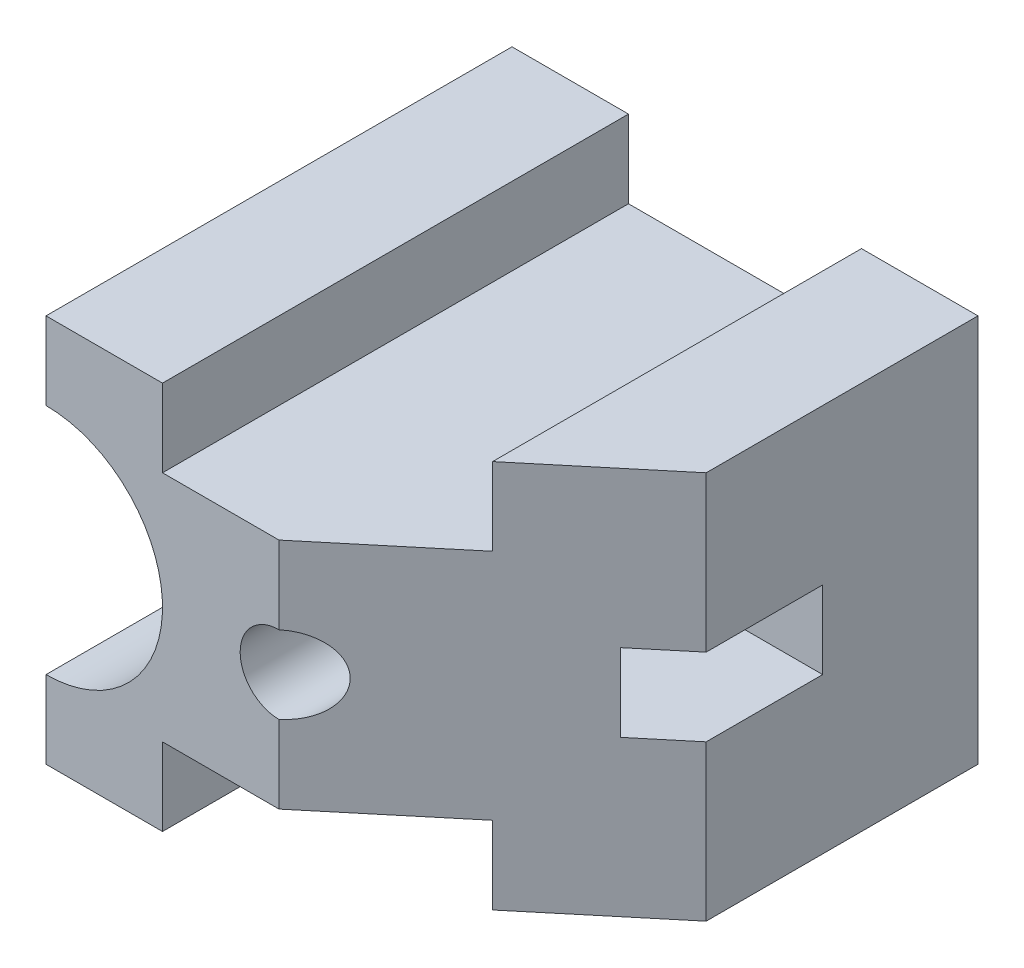
ISO-10303-21;
HEADER;
FILE_DESCRIPTION(('STEP AP214'),'2;1');
FILE_NAME('part.step','',(''),(''),'','','');
FILE_SCHEMA(('AUTOMOTIVE_DESIGN { 1 0 10303 214 1 1 1 1 }'));
ENDSEC;
DATA;
#1=APPLICATION_CONTEXT('core data for automotive mechanical design processes');
#2=APPLICATION_PROTOCOL_DEFINITION('international standard','automotive_design',2000,#1);
#3=PRODUCT_CONTEXT('',#1,'mechanical');
#4=PRODUCT('Part','Part','',(#3));
#5=PRODUCT_RELATED_PRODUCT_CATEGORY('part','',(#4));
#6=PRODUCT_DEFINITION_FORMATION('','',#4);
#7=PRODUCT_DEFINITION_CONTEXT('part definition',#1,'design');
#8=PRODUCT_DEFINITION('design','',#6,#7);
#9=PRODUCT_DEFINITION_SHAPE('','',#8);
#10=(LENGTH_UNIT() NAMED_UNIT(*) SI_UNIT(.MILLI.,.METRE.));
#11=(NAMED_UNIT(*) PLANE_ANGLE_UNIT() SI_UNIT($,.RADIAN.));
#12=(NAMED_UNIT(*) SI_UNIT($,.STERADIAN.) SOLID_ANGLE_UNIT());
#13=UNCERTAINTY_MEASURE_WITH_UNIT(LENGTH_MEASURE(1.E-05),#10,'distance_accuracy_value','');
#14=(GEOMETRIC_REPRESENTATION_CONTEXT(3) GLOBAL_UNCERTAINTY_ASSIGNED_CONTEXT((#13)) GLOBAL_UNIT_ASSIGNED_CONTEXT((#10,
#11,#12)) REPRESENTATION_CONTEXT('',''));
#15=CARTESIAN_POINT('',(0.,0.,0.));
#16=DIRECTION('',(0.,0.,1.));
#17=DIRECTION('',(1.,0.,0.));
#18=AXIS2_PLACEMENT_3D('',#15,#16,#17);
#19=CARTESIAN_POINT('',(-8.20312500000006,-7.890625,60.));
#20=DIRECTION('',(0.,0.,-1.));
#21=DIRECTION('',(-1.,0.,0.));
#22=AXIS2_PLACEMENT_3D('',#19,#20,#21);
#23=CYLINDRICAL_SURFACE('',#22,5.);
#24=CARTESIAN_POINT('',(-8.20312500000006,-7.890625,40.));
#25=DIRECTION('',(0.,0.,1.));
#26=DIRECTION('',(0.,-1.,0.));
#27=AXIS2_PLACEMENT_3D('',#24,#25,#26);
#28=CIRCLE('',#27,5.);
#29=CARTESIAN_POINT('',(-8.20312500000006,-12.890625,40.));
#30=VERTEX_POINT('',#29);
#31=CARTESIAN_POINT('',(-8.20312500000006,-2.890625,40.));
#32=VERTEX_POINT('',#31);
#33=EDGE_CURVE('E247',#30,#32,#28,.T.);
#34=ORIENTED_EDGE('',*,*,#33,.F.);
#35=EDGE_CURVE('E244',#32,#30,#28,.T.);
#36=ORIENTED_EDGE('',*,*,#35,.F.);
#37=EDGE_LOOP('',(#34,#36));
#38=FACE_BOUND('',#37,.T.);
#39=CARTESIAN_POINT('',(-8.20312500000006,-7.890625,60.));
#40=DIRECTION('',(-0.640184399664481,0.,-0.768221279597375));
#41=DIRECTION('',(0.768221279597375,0.,-0.640184399664481));
#42=AXIS2_PLACEMENT_3D('',#39,#40,#41);
#43=ELLIPSE('',#42,6.50854139658889,5.);
#44=CARTESIAN_POINT('',(-8.20312500000002,-2.890625,60.));
#45=VERTEX_POINT('',#44);
#46=CARTESIAN_POINT('',(-8.20312500000002,-12.890625,60.));
#47=VERTEX_POINT('',#46);
#48=EDGE_CURVE('E424',#45,#47,#43,.T.);
#49=ORIENTED_EDGE('',*,*,#48,.F.);
#50=CARTESIAN_POINT('',(-8.20312500000006,-7.890625,60.));
#51=DIRECTION('',(0.,0.,1.));
#52=DIRECTION('',(1.,0.,0.));
#53=AXIS2_PLACEMENT_3D('',#50,#51,#52);
#54=CIRCLE('',#53,5.);
#55=EDGE_CURVE('E289',#45,#47,#54,.T.);
#56=ORIENTED_EDGE('',*,*,#55,.T.);
#57=EDGE_LOOP('',(#49,#56));
#58=FACE_BOUND('',#57,.T.);
#59=ADVANCED_FACE('F39',(#38,#58),#23,.F.);
#60=CARTESIAN_POINT('',(-38.203125,-7.890625,60.));
#61=DIRECTION('',(0.,0.,1.));
#62=DIRECTION('',(1.,0.,0.));
#63=AXIS2_PLACEMENT_3D('',#60,#61,#62);
#64=PLANE('',#63);
#65=DIRECTION('',(0.,1.,0.));
#66=VECTOR('',#65,1.);
#67=CARTESIAN_POINT('',(-8.20312500000002,-42.890625,60.));
#68=LINE('',#67,#66);
#69=CARTESIAN_POINT('',(-8.20312500000002,7.109375,60.));
#70=VERTEX_POINT('',#69);
#71=EDGE_CURVE('E260',#45,#70,#68,.T.);
#72=ORIENTED_EDGE('',*,*,#71,.T.);
#73=DIRECTION('',(-1.,0.,0.));
#74=VECTOR('',#73,1.);
#75=CARTESIAN_POINT('',(-23.203125,7.109375,60.));
#76=LINE('',#75,#74);
#77=CARTESIAN_POINT('',(-23.203125,7.109375,60.));
#78=VERTEX_POINT('',#77);
#79=EDGE_CURVE('E318',#70,#78,#76,.T.);
#80=ORIENTED_EDGE('',*,*,#79,.T.);
#81=DIRECTION('',(0.,1.,0.));
#82=VECTOR('',#81,1.);
#83=CARTESIAN_POINT('',(-23.203125,17.109375,60.));
#84=LINE('',#83,#82);
#85=CARTESIAN_POINT('',(-23.203125,17.109375,60.));
#86=VERTEX_POINT('',#85);
#87=EDGE_CURVE('E321',#78,#86,#84,.T.);
#88=ORIENTED_EDGE('',*,*,#87,.T.);
#89=DIRECTION('',(-1.,0.,0.));
#90=VECTOR('',#89,1.);
#91=CARTESIAN_POINT('',(-38.203125,17.109375,60.));
#92=LINE('',#91,#90);
#93=CARTESIAN_POINT('',(-38.203125,17.109375,60.));
#94=VERTEX_POINT('',#93);
#95=EDGE_CURVE('E324',#86,#94,#92,.T.);
#96=ORIENTED_EDGE('',*,*,#95,.T.);
#97=DIRECTION('',(0.,-1.,0.));
#98=VECTOR('',#97,1.);
#99=CARTESIAN_POINT('',(-38.203125,17.109375,60.));
#100=LINE('',#99,#98);
#101=CARTESIAN_POINT('',(-38.203125,7.109375,60.));
#102=VERTEX_POINT('',#101);
#103=EDGE_CURVE('E297',#94,#102,#100,.T.);
#104=ORIENTED_EDGE('',*,*,#103,.T.);
#105=CARTESIAN_POINT('',(-38.203125,-7.890625,60.));
#106=DIRECTION('',(0.,0.,-1.));
#107=DIRECTION('',(1.,0.,0.));
#108=AXIS2_PLACEMENT_3D('',#105,#106,#107);
#109=CIRCLE('',#108,15.);
#110=CARTESIAN_POINT('',(-38.203125,-22.890625,60.));
#111=VERTEX_POINT('',#110);
#112=EDGE_CURVE('E301',#102,#111,#109,.T.);
#113=ORIENTED_EDGE('',*,*,#112,.T.);
#114=DIRECTION('',(0.,-1.,0.));
#115=VECTOR('',#114,1.);
#116=CARTESIAN_POINT('',(-38.203125,-22.890625,60.));
#117=LINE('',#116,#115);
#118=CARTESIAN_POINT('',(-38.203125,-32.890625,60.));
#119=VERTEX_POINT('',#118);
#120=EDGE_CURVE('E305',#111,#119,#117,.T.);
#121=ORIENTED_EDGE('',*,*,#120,.T.);
#122=DIRECTION('',(1.,0.,0.));
#123=VECTOR('',#122,1.);
#124=CARTESIAN_POINT('',(-38.203125,-32.890625,60.));
#125=LINE('',#124,#123);
#126=CARTESIAN_POINT('',(-23.203125,-32.890625,60.));
#127=VERTEX_POINT('',#126);
#128=EDGE_CURVE('E308',#119,#127,#125,.T.);
#129=ORIENTED_EDGE('',*,*,#128,.T.);
#130=DIRECTION('',(0.,1.,0.));
#131=VECTOR('',#130,1.);
#132=CARTESIAN_POINT('',(-23.203125,-22.890625,60.));
#133=LINE('',#132,#131);
#134=CARTESIAN_POINT('',(-23.203125,-22.890625,60.));
#135=VERTEX_POINT('',#134);
#136=EDGE_CURVE('E311',#127,#135,#133,.T.);
#137=ORIENTED_EDGE('',*,*,#136,.T.);
#138=DIRECTION('',(1.,0.,0.));
#139=VECTOR('',#138,1.);
#140=CARTESIAN_POINT('',(-23.203125,-22.890625,60.));
#141=LINE('',#140,#139);
#142=CARTESIAN_POINT('',(-8.20312500000002,-22.890625,60.));
#143=VERTEX_POINT('',#142);
#144=EDGE_CURVE('E314',#135,#143,#141,.T.);
#145=ORIENTED_EDGE('',*,*,#144,.T.);
#146=EDGE_CURVE('E264',#143,#47,#68,.T.);
#147=ORIENTED_EDGE('',*,*,#146,.T.);
#148=ORIENTED_EDGE('',*,*,#55,.F.);
#149=EDGE_LOOP('',(#72,#80,#88,#96,#104,#113,#121,#129,#137,#145,#147,#148));
#150=FACE_BOUND('',#149,.T.);
#151=ADVANCED_FACE('F455',(#150),#64,.T.);
#152=CARTESIAN_POINT('',(-38.203125,-7.890625,0.));
#153=DIRECTION('',(0.,0.,1.));
#154=DIRECTION('',(1.,0.,0.));
#155=AXIS2_PLACEMENT_3D('',#152,#153,#154);
#156=PLANE('',#155);
#157=DIRECTION('',(0.,-1.,0.));
#158=VECTOR('',#157,1.);
#159=CARTESIAN_POINT('',(-38.203125,17.109375,0.));
#160=LINE('',#159,#158);
#161=CARTESIAN_POINT('',(-38.203125,17.109375,0.));
#162=VERTEX_POINT('',#161);
#163=CARTESIAN_POINT('',(-38.203125,7.109375,0.));
#164=VERTEX_POINT('',#163);
#165=EDGE_CURVE('E293',#162,#164,#160,.T.);
#166=ORIENTED_EDGE('',*,*,#165,.F.);
#167=DIRECTION('',(-1.,0.,0.));
#168=VECTOR('',#167,1.);
#169=CARTESIAN_POINT('',(-38.203125,17.109375,0.));
#170=LINE('',#169,#168);
#171=CARTESIAN_POINT('',(-23.203125,17.109375,0.));
#172=VERTEX_POINT('',#171);
#173=EDGE_CURVE('E302',#172,#162,#170,.T.);
#174=ORIENTED_EDGE('',*,*,#173,.F.);
#175=DIRECTION('',(0.,1.,0.));
#176=VECTOR('',#175,1.);
#177=CARTESIAN_POINT('',(-23.203125,17.109375,0.));
#178=LINE('',#177,#176);
#179=CARTESIAN_POINT('',(-23.203125,7.109375,0.));
#180=VERTEX_POINT('',#179);
#181=EDGE_CURVE('E370',#180,#172,#178,.T.);
#182=ORIENTED_EDGE('',*,*,#181,.F.);
#183=DIRECTION('',(-1.,0.,0.));
#184=VECTOR('',#183,1.);
#185=CARTESIAN_POINT('',(-23.203125,7.109375,0.));
#186=LINE('',#185,#184);
#187=CARTESIAN_POINT('',(6.79687499999999,7.109375,0.));
#188=VERTEX_POINT('',#187);
#189=EDGE_CURVE('E367',#188,#180,#186,.T.);
#190=ORIENTED_EDGE('',*,*,#189,.F.);
#191=DIRECTION('',(0.,-1.,0.));
#192=VECTOR('',#191,1.);
#193=CARTESIAN_POINT('',(6.7968749999999,17.109375,0.));
#194=LINE('',#193,#192);
#195=CARTESIAN_POINT('',(6.7968749999999,17.109375,0.));
#196=VERTEX_POINT('',#195);
#197=EDGE_CURVE('E363',#196,#188,#194,.T.);
#198=ORIENTED_EDGE('',*,*,#197,.F.);
#199=DIRECTION('',(-1.,0.,0.));
#200=VECTOR('',#199,1.);
#201=CARTESIAN_POINT('',(6.7968749999999,17.109375,0.));
#202=LINE('',#201,#200);
#203=CARTESIAN_POINT('',(21.7968749999999,17.109375,0.));
#204=VERTEX_POINT('',#203);
#205=EDGE_CURVE('E359',#204,#196,#202,.T.);
#206=ORIENTED_EDGE('',*,*,#205,.F.);
#207=DIRECTION('',(0.,1.,0.));
#208=VECTOR('',#207,1.);
#209=CARTESIAN_POINT('',(21.7968749999999,17.109375,0.));
#210=LINE('',#209,#208);
#211=CARTESIAN_POINT('',(21.7968749999999,-32.890625,0.));
#212=VERTEX_POINT('',#211);
#213=EDGE_CURVE('E355',#212,#204,#210,.T.);
#214=ORIENTED_EDGE('',*,*,#213,.F.);
#215=DIRECTION('',(1.,0.,0.));
#216=VECTOR('',#215,1.);
#217=CARTESIAN_POINT('',(6.79687499999991,-32.890625,0.));
#218=LINE('',#217,#216);
#219=CARTESIAN_POINT('',(6.79687499999991,-32.890625,0.));
#220=VERTEX_POINT('',#219);
#221=EDGE_CURVE('E351',#220,#212,#218,.T.);
#222=ORIENTED_EDGE('',*,*,#221,.F.);
#223=DIRECTION('',(0.,-1.,0.));
#224=VECTOR('',#223,1.);
#225=CARTESIAN_POINT('',(6.79687499999982,-22.890625,0.));
#226=LINE('',#225,#224);
#227=CARTESIAN_POINT('',(6.79687499999982,-22.890625,0.));
#228=VERTEX_POINT('',#227);
#229=EDGE_CURVE('E347',#228,#220,#226,.T.);
#230=ORIENTED_EDGE('',*,*,#229,.F.);
#231=DIRECTION('',(1.,0.,0.));
#232=VECTOR('',#231,1.);
#233=CARTESIAN_POINT('',(-23.203125,-22.890625,0.));
#234=LINE('',#233,#232);
#235=CARTESIAN_POINT('',(-23.203125,-22.890625,0.));
#236=VERTEX_POINT('',#235);
#237=EDGE_CURVE('E343',#236,#228,#234,.T.);
#238=ORIENTED_EDGE('',*,*,#237,.F.);
#239=DIRECTION('',(0.,1.,0.));
#240=VECTOR('',#239,1.);
#241=CARTESIAN_POINT('',(-23.203125,-22.890625,0.));
#242=LINE('',#241,#240);
#243=CARTESIAN_POINT('',(-23.203125,-32.890625,0.));
#244=VERTEX_POINT('',#243);
#245=EDGE_CURVE('E340',#244,#236,#242,.T.);
#246=ORIENTED_EDGE('',*,*,#245,.F.);
#247=DIRECTION('',(1.,0.,0.));
#248=VECTOR('',#247,1.);
#249=CARTESIAN_POINT('',(-38.203125,-32.890625,0.));
#250=LINE('',#249,#248);
#251=CARTESIAN_POINT('',(-38.203125,-32.890625,0.));
#252=VERTEX_POINT('',#251);
#253=EDGE_CURVE('E337',#252,#244,#250,.T.);
#254=ORIENTED_EDGE('',*,*,#253,.F.);
#255=DIRECTION('',(0.,-1.,0.));
#256=VECTOR('',#255,1.);
#257=CARTESIAN_POINT('',(-38.203125,-22.890625,0.));
#258=LINE('',#257,#256);
#259=CARTESIAN_POINT('',(-38.203125,-22.890625,0.));
#260=VERTEX_POINT('',#259);
#261=EDGE_CURVE('E334',#260,#252,#258,.T.);
#262=ORIENTED_EDGE('',*,*,#261,.F.);
#263=CARTESIAN_POINT('',(-38.203125,-7.890625,0.));
#264=DIRECTION('',(0.,0.,-1.));
#265=DIRECTION('',(1.,0.,0.));
#266=AXIS2_PLACEMENT_3D('',#263,#264,#265);
#267=CIRCLE('',#266,15.);
#268=EDGE_CURVE('E331',#164,#260,#267,.T.);
#269=ORIENTED_EDGE('',*,*,#268,.F.);
#270=EDGE_LOOP('',(#166,#174,#182,#190,#198,#206,#214,#222,#230,#238,#246,#254,#262,#269));
#271=FACE_BOUND('',#270,.T.);
#272=CARTESIAN_POINT('',(-8.20312500000006,-7.890625,0.));
#273=DIRECTION('',(0.,0.,1.));
#274=DIRECTION('',(1.,0.,0.));
#275=AXIS2_PLACEMENT_3D('',#272,#273,#274);
#276=CIRCLE('',#275,5.);
#277=CARTESIAN_POINT('',(-3.20312500000006,-7.890625,0.));
#278=VERTEX_POINT('',#277);
#279=EDGE_CURVE('E288',#278,#278,#276,.T.);
#280=ORIENTED_EDGE('',*,*,#279,.T.);
#281=EDGE_LOOP('',(#280));
#282=FACE_BOUND('',#281,.T.);
#283=ADVANCED_FACE('F453',(#271,#282),#156,.F.);
#284=CARTESIAN_POINT('',(-38.203125,17.109375,60.));
#285=DIRECTION('',(1.,0.,0.));
#286=DIRECTION('',(0.,0.,-1.));
#287=AXIS2_PLACEMENT_3D('',#284,#285,#286);
#288=PLANE('',#287);
#289=ORIENTED_EDGE('',*,*,#165,.T.);
#290=DIRECTION('',(0.,0.,-1.));
#291=VECTOR('',#290,1.);
#292=CARTESIAN_POINT('',(-38.203125,7.109375,60.));
#293=LINE('',#292,#291);
#294=EDGE_CURVE('E420',#102,#164,#293,.T.);
#295=ORIENTED_EDGE('',*,*,#294,.F.);
#296=ORIENTED_EDGE('',*,*,#103,.F.);
#297=DIRECTION('',(0.,0.,-1.));
#298=VECTOR('',#297,1.);
#299=CARTESIAN_POINT('',(-38.203125,17.109375,60.));
#300=LINE('',#299,#298);
#301=EDGE_CURVE('E327',#94,#162,#300,.T.);
#302=ORIENTED_EDGE('',*,*,#301,.T.);
#303=EDGE_LOOP('',(#289,#295,#296,#302));
#304=FACE_BOUND('',#303,.T.);
#305=ADVANCED_FACE('F41',(#304),#288,.F.);
#306=CARTESIAN_POINT('',(-38.203125,-7.890625,60.));
#307=DIRECTION('',(0.,0.,-1.));
#308=DIRECTION('',(-1.,0.,0.));
#309=AXIS2_PLACEMENT_3D('',#306,#307,#308);
#310=CYLINDRICAL_SURFACE('',#309,15.);
#311=DIRECTION('',(0.,0.,-1.));
#312=VECTOR('',#311,1.);
#313=CARTESIAN_POINT('',(-24.0609893762691,-2.890625,60.));
#314=LINE('',#313,#312);
#315=CARTESIAN_POINT('',(-24.0609893762691,-2.890625,20.));
#316=VERTEX_POINT('',#315);
#317=CARTESIAN_POINT('',(-24.0609893762691,-2.890625,40.));
#318=VERTEX_POINT('',#317);
#319=EDGE_CURVE('E240',#316,#318,#314,.F.);
#320=ORIENTED_EDGE('',*,*,#319,.T.);
#321=CARTESIAN_POINT('',(-38.203125,-7.890625,40.));
#322=DIRECTION('',(0.,0.,1.));
#323=DIRECTION('',(0.,-1.,0.));
#324=AXIS2_PLACEMENT_3D('',#321,#322,#323);
#325=CIRCLE('',#324,15.);
#326=CARTESIAN_POINT('',(-24.0609893762691,-12.890625,40.));
#327=VERTEX_POINT('',#326);
#328=EDGE_CURVE('E248',#318,#327,#325,.F.);
#329=ORIENTED_EDGE('',*,*,#328,.T.);
#330=DIRECTION('',(0.,0.,-1.));
#331=VECTOR('',#330,1.);
#332=CARTESIAN_POINT('',(-24.0609893762691,-12.890625,60.));
#333=LINE('',#332,#331);
#334=CARTESIAN_POINT('',(-24.0609893762691,-12.890625,20.));
#335=VERTEX_POINT('',#334);
#336=EDGE_CURVE('E236',#327,#335,#333,.T.);
#337=ORIENTED_EDGE('',*,*,#336,.T.);
#338=CARTESIAN_POINT('',(-38.203125,-7.890625,20.));
#339=DIRECTION('',(0.,0.,-1.));
#340=DIRECTION('',(0.,1.,0.));
#341=AXIS2_PLACEMENT_3D('',#338,#339,#340);
#342=CIRCLE('',#341,15.);
#343=EDGE_CURVE('E252',#335,#316,#342,.F.);
#344=ORIENTED_EDGE('',*,*,#343,.T.);
#345=EDGE_LOOP('',(#320,#329,#337,#344));
#346=FACE_BOUND('',#345,.T.);
#347=ORIENTED_EDGE('',*,*,#268,.T.);
#348=DIRECTION('',(0.,0.,-1.));
#349=VECTOR('',#348,1.);
#350=CARTESIAN_POINT('',(-38.203125,-22.890625,60.));
#351=LINE('',#350,#349);
#352=EDGE_CURVE('E416',#111,#260,#351,.T.);
#353=ORIENTED_EDGE('',*,*,#352,.F.);
#354=ORIENTED_EDGE('',*,*,#112,.F.);
#355=ORIENTED_EDGE('',*,*,#294,.T.);
#356=EDGE_LOOP('',(#347,#353,#354,#355));
#357=FACE_BOUND('',#356,.T.);
#358=ADVANCED_FACE('F462',(#346,#357),#310,.F.);
#359=CARTESIAN_POINT('',(-38.203125,-22.890625,60.));
#360=DIRECTION('',(1.,0.,0.));
#361=DIRECTION('',(0.,0.,-1.));
#362=AXIS2_PLACEMENT_3D('',#359,#360,#361);
#363=PLANE('',#362);
#364=ORIENTED_EDGE('',*,*,#261,.T.);
#365=DIRECTION('',(0.,0.,-1.));
#366=VECTOR('',#365,1.);
#367=CARTESIAN_POINT('',(-38.203125,-32.890625,60.));
#368=LINE('',#367,#366);
#369=EDGE_CURVE('E412',#119,#252,#368,.T.);
#370=ORIENTED_EDGE('',*,*,#369,.F.);
#371=ORIENTED_EDGE('',*,*,#120,.F.);
#372=ORIENTED_EDGE('',*,*,#352,.T.);
#373=EDGE_LOOP('',(#364,#370,#371,#372));
#374=FACE_BOUND('',#373,.T.);
#375=ADVANCED_FACE('F502',(#374),#363,.F.);
#376=CARTESIAN_POINT('',(-38.203125,-32.890625,60.));
#377=DIRECTION('',(0.,1.,0.));
#378=DIRECTION('',(0.,0.,1.));
#379=AXIS2_PLACEMENT_3D('',#376,#377,#378);
#380=PLANE('',#379);
#381=ORIENTED_EDGE('',*,*,#253,.T.);
#382=DIRECTION('',(0.,0.,-1.));
#383=VECTOR('',#382,1.);
#384=CARTESIAN_POINT('',(-23.203125,-32.890625,60.));
#385=LINE('',#384,#383);
#386=EDGE_CURVE('E408',#127,#244,#385,.T.);
#387=ORIENTED_EDGE('',*,*,#386,.F.);
#388=ORIENTED_EDGE('',*,*,#128,.F.);
#389=ORIENTED_EDGE('',*,*,#369,.T.);
#390=EDGE_LOOP('',(#381,#387,#388,#389));
#391=FACE_BOUND('',#390,.T.);
#392=ADVANCED_FACE('F514',(#391),#380,.F.);
#393=CARTESIAN_POINT('',(-23.203125,-22.890625,60.));
#394=DIRECTION('',(-1.,0.,0.));
#395=DIRECTION('',(0.,-1.,0.));
#396=AXIS2_PLACEMENT_3D('',#393,#394,#395);
#397=PLANE('',#396);
#398=ORIENTED_EDGE('',*,*,#245,.T.);
#399=DIRECTION('',(0.,0.,-1.));
#400=VECTOR('',#399,1.);
#401=CARTESIAN_POINT('',(-23.203125,-22.890625,60.));
#402=LINE('',#401,#400);
#403=EDGE_CURVE('E404',#135,#236,#402,.T.);
#404=ORIENTED_EDGE('',*,*,#403,.F.);
#405=ORIENTED_EDGE('',*,*,#136,.F.);
#406=ORIENTED_EDGE('',*,*,#386,.T.);
#407=EDGE_LOOP('',(#398,#404,#405,#406));
#408=FACE_BOUND('',#407,.T.);
#409=ADVANCED_FACE('F518',(#408),#397,.F.);
#410=CARTESIAN_POINT('',(-23.203125,-22.890625,60.));
#411=DIRECTION('',(0.,1.,0.));
#412=DIRECTION('',(0.,0.,1.));
#413=AXIS2_PLACEMENT_3D('',#410,#411,#412);
#414=PLANE('',#413);
#415=DIRECTION('',(0.,0.,-1.));
#416=VECTOR('',#415,1.);
#417=CARTESIAN_POINT('',(6.79687499999982,-22.890625,60.));
#418=LINE('',#417,#416);
#419=CARTESIAN_POINT('',(6.79687499999982,-22.890625,47.5000000000001));
#420=VERTEX_POINT('',#419);
#421=EDGE_CURVE('E401',#420,#228,#418,.T.);
#422=ORIENTED_EDGE('',*,*,#421,.F.);
#423=DIRECTION('',(-0.768221279597375,0.,0.640184399664481));
#424=VECTOR('',#423,1.);
#425=CARTESIAN_POINT('',(-17.0555840163934,-22.890625,67.3770491803279));
#426=LINE('',#425,#424);
#427=EDGE_CURVE('E284',#420,#143,#426,.T.);
#428=ORIENTED_EDGE('',*,*,#427,.T.);
#429=ORIENTED_EDGE('',*,*,#144,.F.);
#430=ORIENTED_EDGE('',*,*,#403,.T.);
#431=ORIENTED_EDGE('',*,*,#237,.T.);
#432=EDGE_LOOP('',(#422,#428,#429,#430,#431));
#433=FACE_BOUND('',#432,.T.);
#434=ADVANCED_FACE('F558',(#433),#414,.F.);
#435=CARTESIAN_POINT('',(6.79687499999982,-22.890625,60.));
#436=DIRECTION('',(1.,0.,0.));
#437=DIRECTION('',(0.,1.,0.));
#438=AXIS2_PLACEMENT_3D('',#435,#436,#437);
#439=PLANE('',#438);
#440=DIRECTION('',(0.,0.,-1.));
#441=VECTOR('',#440,1.);
#442=CARTESIAN_POINT('',(6.79687499999991,-32.890625,60.));
#443=LINE('',#442,#441);
#444=CARTESIAN_POINT('',(6.79687499999991,-32.890625,47.5));
#445=VERTEX_POINT('',#444);
#446=EDGE_CURVE('E398',#445,#220,#443,.T.);
#447=ORIENTED_EDGE('',*,*,#446,.F.);
#448=DIRECTION('',(0.,1.,0.));
#449=VECTOR('',#448,1.);
#450=CARTESIAN_POINT('',(6.79687499999982,-22.8906249999999,47.5000000000001));
#451=LINE('',#450,#449);
#452=EDGE_CURVE('E280',#445,#420,#451,.T.);
#453=ORIENTED_EDGE('',*,*,#452,.T.);
#454=ORIENTED_EDGE('',*,*,#421,.T.);
#455=ORIENTED_EDGE('',*,*,#229,.T.);
#456=EDGE_LOOP('',(#447,#453,#454,#455));
#457=FACE_BOUND('',#456,.T.);
#458=ADVANCED_FACE('F555',(#457),#439,.F.);
#459=CARTESIAN_POINT('',(6.79687499999991,-32.890625,60.));
#460=DIRECTION('',(0.,1.,0.));
#461=DIRECTION('',(0.,0.,1.));
#462=AXIS2_PLACEMENT_3D('',#459,#460,#461);
#463=PLANE('',#462);
#464=DIRECTION('',(0.,0.,-1.));
#465=VECTOR('',#464,1.);
#466=CARTESIAN_POINT('',(21.7968749999999,-32.890625,60.));
#467=LINE('',#466,#465);
#468=CARTESIAN_POINT('',(21.7968749999999,-32.890625,35.));
#469=VERTEX_POINT('',#468);
#470=EDGE_CURVE('E395',#469,#212,#467,.T.);
#471=ORIENTED_EDGE('',*,*,#470,.F.);
#472=DIRECTION('',(-0.768221279597375,0.,0.640184399664481));
#473=VECTOR('',#472,1.);
#474=CARTESIAN_POINT('',(0.649334016393366,-32.890625,52.6229508196722));
#475=LINE('',#474,#473);
#476=EDGE_CURVE('E276',#469,#445,#475,.T.);
#477=ORIENTED_EDGE('',*,*,#476,.T.);
#478=ORIENTED_EDGE('',*,*,#446,.T.);
#479=ORIENTED_EDGE('',*,*,#221,.T.);
#480=EDGE_LOOP('',(#471,#477,#478,#479));
#481=FACE_BOUND('',#480,.T.);
#482=ADVANCED_FACE('F552',(#481),#463,.F.);
#483=CARTESIAN_POINT('',(21.7968749999999,17.109375,60.));
#484=DIRECTION('',(-1.,0.,0.));
#485=DIRECTION('',(0.,-1.,0.));
#486=AXIS2_PLACEMENT_3D('',#483,#484,#485);
#487=PLANE('',#486);
#488=DIRECTION('',(0.,1.,0.));
#489=VECTOR('',#488,1.);
#490=CARTESIAN_POINT('',(21.7968749999999,-42.890625,35.));
#491=LINE('',#490,#489);
#492=CARTESIAN_POINT('',(21.7968749999999,-2.890625,35.));
#493=VERTEX_POINT('',#492);
#494=CARTESIAN_POINT('',(21.7968749999999,17.109375,35.));
#495=VERTEX_POINT('',#494);
#496=EDGE_CURVE('E259',#493,#495,#491,.T.);
#497=ORIENTED_EDGE('',*,*,#496,.F.);
#498=DIRECTION('',(0.,0.,1.));
#499=VECTOR('',#498,1.);
#500=CARTESIAN_POINT('',(21.7968749999999,-2.890625,40.));
#501=LINE('',#500,#499);
#502=CARTESIAN_POINT('',(21.7968749999999,-2.890625,20.));
#503=VERTEX_POINT('',#502);
#504=EDGE_CURVE('E219',#503,#493,#501,.T.);
#505=ORIENTED_EDGE('',*,*,#504,.F.);
#506=DIRECTION('',(0.,1.,0.));
#507=VECTOR('',#506,1.);
#508=CARTESIAN_POINT('',(21.7968749999999,-2.890625,20.));
#509=LINE('',#508,#507);
#510=CARTESIAN_POINT('',(21.7968749999999,-12.890625,20.));
#511=VERTEX_POINT('',#510);
#512=EDGE_CURVE('E199',#511,#503,#509,.T.);
#513=ORIENTED_EDGE('',*,*,#512,.F.);
#514=DIRECTION('',(0.,0.,-1.));
#515=VECTOR('',#514,1.);
#516=CARTESIAN_POINT('',(21.7968749999999,-12.890625,40.));
#517=LINE('',#516,#515);
#518=CARTESIAN_POINT('',(21.7968749999999,-12.890625,35.));
#519=VERTEX_POINT('',#518);
#520=EDGE_CURVE('E207',#519,#511,#517,.T.);
#521=ORIENTED_EDGE('',*,*,#520,.F.);
#522=EDGE_CURVE('E265',#469,#519,#491,.T.);
#523=ORIENTED_EDGE('',*,*,#522,.F.);
#524=ORIENTED_EDGE('',*,*,#470,.T.);
#525=ORIENTED_EDGE('',*,*,#213,.T.);
#526=DIRECTION('',(0.,0.,-1.));
#527=VECTOR('',#526,1.);
#528=CARTESIAN_POINT('',(21.7968749999999,17.109375,60.));
#529=LINE('',#528,#527);
#530=EDGE_CURVE('E392',#495,#204,#529,.T.);
#531=ORIENTED_EDGE('',*,*,#530,.F.);
#532=EDGE_LOOP('',(#497,#505,#513,#521,#523,#524,#525,#531));
#533=FACE_BOUND('',#532,.T.);
#534=ADVANCED_FACE('F218',(#533),#487,.F.);
#535=CARTESIAN_POINT('',(6.7968749999999,17.109375,60.));
#536=DIRECTION('',(0.,-1.,0.));
#537=DIRECTION('',(0.,0.,-1.));
#538=AXIS2_PLACEMENT_3D('',#535,#536,#537);
#539=PLANE('',#538);
#540=DIRECTION('',(0.,0.,-1.));
#541=VECTOR('',#540,1.);
#542=CARTESIAN_POINT('',(6.7968749999999,17.109375,60.));
#543=LINE('',#542,#541);
#544=CARTESIAN_POINT('',(6.7968749999999,17.109375,47.5));
#545=VERTEX_POINT('',#544);
#546=EDGE_CURVE('E389',#545,#196,#543,.T.);
#547=ORIENTED_EDGE('',*,*,#546,.F.);
#548=DIRECTION('',(-0.768221279597375,0.,0.640184399664481));
#549=VECTOR('',#548,1.);
#550=CARTESIAN_POINT('',(-8.20312500000002,17.109375,60.));
#551=LINE('',#550,#549);
#552=EDGE_CURVE('E256',#495,#545,#551,.T.);
#553=ORIENTED_EDGE('',*,*,#552,.F.);
#554=ORIENTED_EDGE('',*,*,#530,.T.);
#555=ORIENTED_EDGE('',*,*,#205,.T.);
#556=EDGE_LOOP('',(#547,#553,#554,#555));
#557=FACE_BOUND('',#556,.T.);
#558=ADVANCED_FACE('F546',(#557),#539,.F.);
#559=CARTESIAN_POINT('',(6.7968749999999,17.109375,60.));
#560=DIRECTION('',(1.,0.,0.));
#561=DIRECTION('',(0.,1.,0.));
#562=AXIS2_PLACEMENT_3D('',#559,#560,#561);
#563=PLANE('',#562);
#564=DIRECTION('',(0.,0.,-1.));
#565=VECTOR('',#564,1.);
#566=CARTESIAN_POINT('',(6.79687499999999,7.109375,60.));
#567=LINE('',#566,#565);
#568=CARTESIAN_POINT('',(6.79687499999999,7.109375,47.5));
#569=VERTEX_POINT('',#568);
#570=EDGE_CURVE('E386',#569,#188,#567,.T.);
#571=ORIENTED_EDGE('',*,*,#570,.F.);
#572=DIRECTION('',(0.,1.,0.));
#573=VECTOR('',#572,1.);
#574=CARTESIAN_POINT('',(6.7968749999999,17.1093750000001,47.5));
#575=LINE('',#574,#573);
#576=EDGE_CURVE('E272',#569,#545,#575,.T.);
#577=ORIENTED_EDGE('',*,*,#576,.T.);
#578=ORIENTED_EDGE('',*,*,#546,.T.);
#579=ORIENTED_EDGE('',*,*,#197,.T.);
#580=EDGE_LOOP('',(#571,#577,#578,#579));
#581=FACE_BOUND('',#580,.T.);
#582=ADVANCED_FACE('F542',(#581),#563,.F.);
#583=CARTESIAN_POINT('',(-23.203125,7.109375,60.));
#584=DIRECTION('',(0.,-1.,0.));
#585=DIRECTION('',(0.,0.,-1.));
#586=AXIS2_PLACEMENT_3D('',#583,#584,#585);
#587=PLANE('',#586);
#588=ORIENTED_EDGE('',*,*,#79,.F.);
#589=DIRECTION('',(0.768221279597375,0.,-0.640184399664481));
#590=VECTOR('',#589,1.);
#591=CARTESIAN_POINT('',(-17.0555840163934,7.109375,67.3770491803279));
#592=LINE('',#591,#590);
#593=EDGE_CURVE('E268',#70,#569,#592,.T.);
#594=ORIENTED_EDGE('',*,*,#593,.T.);
#595=ORIENTED_EDGE('',*,*,#570,.T.);
#596=ORIENTED_EDGE('',*,*,#189,.T.);
#597=DIRECTION('',(0.,0.,-1.));
#598=VECTOR('',#597,1.);
#599=CARTESIAN_POINT('',(-23.203125,7.109375,60.));
#600=LINE('',#599,#598);
#601=EDGE_CURVE('E382',#78,#180,#600,.T.);
#602=ORIENTED_EDGE('',*,*,#601,.F.);
#603=EDGE_LOOP('',(#588,#594,#595,#596,#602));
#604=FACE_BOUND('',#603,.T.);
#605=ADVANCED_FACE('F536',(#604),#587,.F.);
#606=CARTESIAN_POINT('',(-23.203125,17.109375,60.));
#607=DIRECTION('',(-1.,0.,0.));
#608=DIRECTION('',(0.,0.,1.));
#609=AXIS2_PLACEMENT_3D('',#606,#607,#608);
#610=PLANE('',#609);
#611=ORIENTED_EDGE('',*,*,#181,.T.);
#612=DIRECTION('',(0.,0.,-1.));
#613=VECTOR('',#612,1.);
#614=CARTESIAN_POINT('',(-23.203125,17.109375,60.));
#615=LINE('',#614,#613);
#616=EDGE_CURVE('E378',#86,#172,#615,.T.);
#617=ORIENTED_EDGE('',*,*,#616,.F.);
#618=ORIENTED_EDGE('',*,*,#87,.F.);
#619=ORIENTED_EDGE('',*,*,#601,.T.);
#620=EDGE_LOOP('',(#611,#617,#618,#619));
#621=FACE_BOUND('',#620,.T.);
#622=ADVANCED_FACE('F532',(#621),#610,.F.);
#623=CARTESIAN_POINT('',(-38.203125,17.109375,60.));
#624=DIRECTION('',(0.,-1.,0.));
#625=DIRECTION('',(0.,0.,-1.));
#626=AXIS2_PLACEMENT_3D('',#623,#624,#625);
#627=PLANE('',#626);
#628=ORIENTED_EDGE('',*,*,#173,.T.);
#629=ORIENTED_EDGE('',*,*,#301,.F.);
#630=ORIENTED_EDGE('',*,*,#95,.F.);
#631=ORIENTED_EDGE('',*,*,#616,.T.);
#632=EDGE_LOOP('',(#628,#629,#630,#631));
#633=FACE_BOUND('',#632,.T.);
#634=ADVANCED_FACE('F449',(#633),#627,.F.);
#635=CARTESIAN_POINT('',(-8.20312500000006,-7.890625,20.));
#636=DIRECTION('',(0.,0.,-1.));
#637=DIRECTION('',(0.,1.,0.));
#638=AXIS2_PLACEMENT_3D('',#635,#636,#637);
#639=CIRCLE('',#638,5.);
#640=CARTESIAN_POINT('',(-8.20312500000006,-2.890625,20.));
#641=VERTEX_POINT('',#640);
#642=CARTESIAN_POINT('',(-8.20312500000006,-12.890625,20.));
#643=VERTEX_POINT('',#642);
#644=EDGE_CURVE('E11',#641,#643,#639,.T.);
#645=ORIENTED_EDGE('',*,*,#644,.F.);
#646=EDGE_CURVE('E43',#643,#641,#639,.T.);
#647=ORIENTED_EDGE('',*,*,#646,.F.);
#648=EDGE_LOOP('',(#645,#647));
#649=FACE_BOUND('',#648,.T.);
#650=ORIENTED_EDGE('',*,*,#279,.F.);
#651=EDGE_LOOP('',(#650));
#652=FACE_BOUND('',#651,.T.);
#653=ADVANCED_FACE('F445',(#649,#652),#23,.F.);
#654=CARTESIAN_POINT('',(-8.20312500000002,-42.890625,60.));
#655=DIRECTION('',(-0.640184399664481,0.,-0.768221279597375));
#656=DIRECTION('',(-0.768221279597375,0.,0.640184399664481));
#657=AXIS2_PLACEMENT_3D('',#654,#655,#656);
#658=PLANE('',#657);
#659=DIRECTION('',(0.,1.,0.));
#660=VECTOR('',#659,1.);
#661=CARTESIAN_POINT('',(15.7968749999999,-42.890625,40.));
#662=LINE('',#661,#660);
#663=CARTESIAN_POINT('',(15.7968749999999,-12.890625,40.));
#664=VERTEX_POINT('',#663);
#665=CARTESIAN_POINT('',(15.7968749999999,-2.890625,40.));
#666=VERTEX_POINT('',#665);
#667=EDGE_CURVE('E429',#664,#666,#662,.T.);
#668=ORIENTED_EDGE('',*,*,#667,.T.);
#669=DIRECTION('',(0.768221279597375,0.,-0.640184399664481));
#670=VECTOR('',#669,1.);
#671=CARTESIAN_POINT('',(-8.20312500000002,-2.890625,60.));
#672=LINE('',#671,#670);
#673=EDGE_CURVE('E432',#666,#493,#672,.T.);
#674=ORIENTED_EDGE('',*,*,#673,.T.);
#675=ORIENTED_EDGE('',*,*,#496,.T.);
#676=ORIENTED_EDGE('',*,*,#552,.T.);
#677=ORIENTED_EDGE('',*,*,#576,.F.);
#678=ORIENTED_EDGE('',*,*,#593,.F.);
#679=ORIENTED_EDGE('',*,*,#71,.F.);
#680=ORIENTED_EDGE('',*,*,#48,.T.);
#681=ORIENTED_EDGE('',*,*,#146,.F.);
#682=ORIENTED_EDGE('',*,*,#427,.F.);
#683=ORIENTED_EDGE('',*,*,#452,.F.);
#684=ORIENTED_EDGE('',*,*,#476,.F.);
#685=ORIENTED_EDGE('',*,*,#522,.T.);
#686=DIRECTION('',(-0.768221279597375,0.,0.640184399664481));
#687=VECTOR('',#686,1.);
#688=CARTESIAN_POINT('',(-8.20312500000001,-12.890625,60.));
#689=LINE('',#688,#687);
#690=EDGE_CURVE('E211',#519,#664,#689,.T.);
#691=ORIENTED_EDGE('',*,*,#690,.T.);
#692=EDGE_LOOP('',(#668,#674,#675,#676,#677,#678,#679,#680,#681,#682,#683,#684,#685,#691));
#693=FACE_BOUND('',#692,.T.);
#694=ADVANCED_FACE('F448',(#693),#658,.F.);
#695=CARTESIAN_POINT('',(-38.2031250000001,-2.890625,20.));
#696=DIRECTION('',(0.,0.,-1.));
#697=DIRECTION('',(0.,1.,0.));
#698=AXIS2_PLACEMENT_3D('',#695,#696,#697);
#699=PLANE('',#698);
#700=DIRECTION('',(1.,0.,0.));
#701=VECTOR('',#700,1.);
#702=CARTESIAN_POINT('',(-38.2031250000001,-12.890625,20.));
#703=LINE('',#702,#701);
#704=EDGE_CURVE('E55',#335,#643,#703,.T.);
#705=ORIENTED_EDGE('',*,*,#704,.T.);
#706=ORIENTED_EDGE('',*,*,#646,.T.);
#707=DIRECTION('',(1.,0.,0.));
#708=VECTOR('',#707,1.);
#709=CARTESIAN_POINT('',(-38.2031250000001,-2.890625,20.));
#710=LINE('',#709,#708);
#711=EDGE_CURVE('E230',#316,#641,#710,.T.);
#712=ORIENTED_EDGE('',*,*,#711,.F.);
#713=ORIENTED_EDGE('',*,*,#343,.F.);
#714=EDGE_LOOP('',(#705,#706,#712,#713));
#715=FACE_BOUND('',#714,.T.);
#716=ADVANCED_FACE('F439',(#715),#699,.F.);
#717=ORIENTED_EDGE('',*,*,#644,.T.);
#718=EDGE_CURVE('E194',#643,#511,#703,.T.);
#719=ORIENTED_EDGE('',*,*,#718,.T.);
#720=ORIENTED_EDGE('',*,*,#512,.T.);
#721=EDGE_CURVE('E231',#641,#503,#710,.T.);
#722=ORIENTED_EDGE('',*,*,#721,.F.);
#723=EDGE_LOOP('',(#717,#719,#720,#722));
#724=FACE_BOUND('',#723,.T.);
#725=ADVANCED_FACE('F196',(#724),#699,.F.);
#726=CARTESIAN_POINT('',(-38.2031250000001,-2.890625,40.));
#727=DIRECTION('',(0.,0.,1.));
#728=DIRECTION('',(0.,-1.,0.));
#729=AXIS2_PLACEMENT_3D('',#726,#727,#728);
#730=PLANE('',#729);
#731=DIRECTION('',(1.,0.,0.));
#732=VECTOR('',#731,1.);
#733=CARTESIAN_POINT('',(-38.2031250000001,-2.890625,40.));
#734=LINE('',#733,#732);
#735=EDGE_CURVE('E63',#318,#32,#734,.T.);
#736=ORIENTED_EDGE('',*,*,#735,.T.);
#737=ORIENTED_EDGE('',*,*,#35,.T.);
#738=DIRECTION('',(1.,0.,0.));
#739=VECTOR('',#738,1.);
#740=CARTESIAN_POINT('',(-38.2031250000001,-12.890625,40.));
#741=LINE('',#740,#739);
#742=EDGE_CURVE('E204',#327,#30,#741,.T.);
#743=ORIENTED_EDGE('',*,*,#742,.F.);
#744=ORIENTED_EDGE('',*,*,#328,.F.);
#745=EDGE_LOOP('',(#736,#737,#743,#744));
#746=FACE_BOUND('',#745,.T.);
#747=ADVANCED_FACE('F477',(#746),#730,.F.);
#748=ORIENTED_EDGE('',*,*,#33,.T.);
#749=EDGE_CURVE('E226',#32,#666,#734,.T.);
#750=ORIENTED_EDGE('',*,*,#749,.T.);
#751=ORIENTED_EDGE('',*,*,#667,.F.);
#752=EDGE_CURVE('E223',#30,#664,#741,.T.);
#753=ORIENTED_EDGE('',*,*,#752,.F.);
#754=EDGE_LOOP('',(#748,#750,#751,#753));
#755=FACE_BOUND('',#754,.T.);
#756=ADVANCED_FACE('F480',(#755),#730,.F.);
#757=CARTESIAN_POINT('',(-38.2031250000001,-2.890625,40.));
#758=DIRECTION('',(0.,1.,0.));
#759=DIRECTION('',(-1.,0.,0.));
#760=AXIS2_PLACEMENT_3D('',#757,#758,#759);
#761=PLANE('',#760);
#762=ORIENTED_EDGE('',*,*,#711,.T.);
#763=ORIENTED_EDGE('',*,*,#721,.T.);
#764=ORIENTED_EDGE('',*,*,#504,.T.);
#765=ORIENTED_EDGE('',*,*,#673,.F.);
#766=ORIENTED_EDGE('',*,*,#749,.F.);
#767=ORIENTED_EDGE('',*,*,#735,.F.);
#768=ORIENTED_EDGE('',*,*,#319,.F.);
#769=EDGE_LOOP('',(#762,#763,#764,#765,#766,#767,#768));
#770=FACE_BOUND('',#769,.T.);
#771=ADVANCED_FACE('F443',(#770),#761,.F.);
#772=CARTESIAN_POINT('',(-38.2031250000001,-12.890625,40.));
#773=DIRECTION('',(0.,-1.,0.));
#774=DIRECTION('',(0.,0.,-1.));
#775=AXIS2_PLACEMENT_3D('',#772,#773,#774);
#776=PLANE('',#775);
#777=ORIENTED_EDGE('',*,*,#742,.T.);
#778=ORIENTED_EDGE('',*,*,#752,.T.);
#779=ORIENTED_EDGE('',*,*,#690,.F.);
#780=ORIENTED_EDGE('',*,*,#520,.T.);
#781=ORIENTED_EDGE('',*,*,#718,.F.);
#782=ORIENTED_EDGE('',*,*,#704,.F.);
#783=ORIENTED_EDGE('',*,*,#336,.F.);
#784=EDGE_LOOP('',(#777,#778,#779,#780,#781,#782,#783));
#785=FACE_BOUND('',#784,.T.);
#786=ADVANCED_FACE('F209',(#785),#776,.F.);
#787=CLOSED_SHELL('',(#59,#151,#283,#305,#358,#375,#392,#409,#434,#458,#482,#534,#558,#582,#605,
#622,#634,#653,#694,#716,#725,#747,#756,#771,#786));
#788=MANIFOLD_SOLID_BREP('B2',#787);
#789=ADVANCED_BREP_SHAPE_REPRESENTATION('',(#18,#788),#14);
#790=SHAPE_DEFINITION_REPRESENTATION(#9,#789);
ENDSEC;
END-ISO-10303-21;
